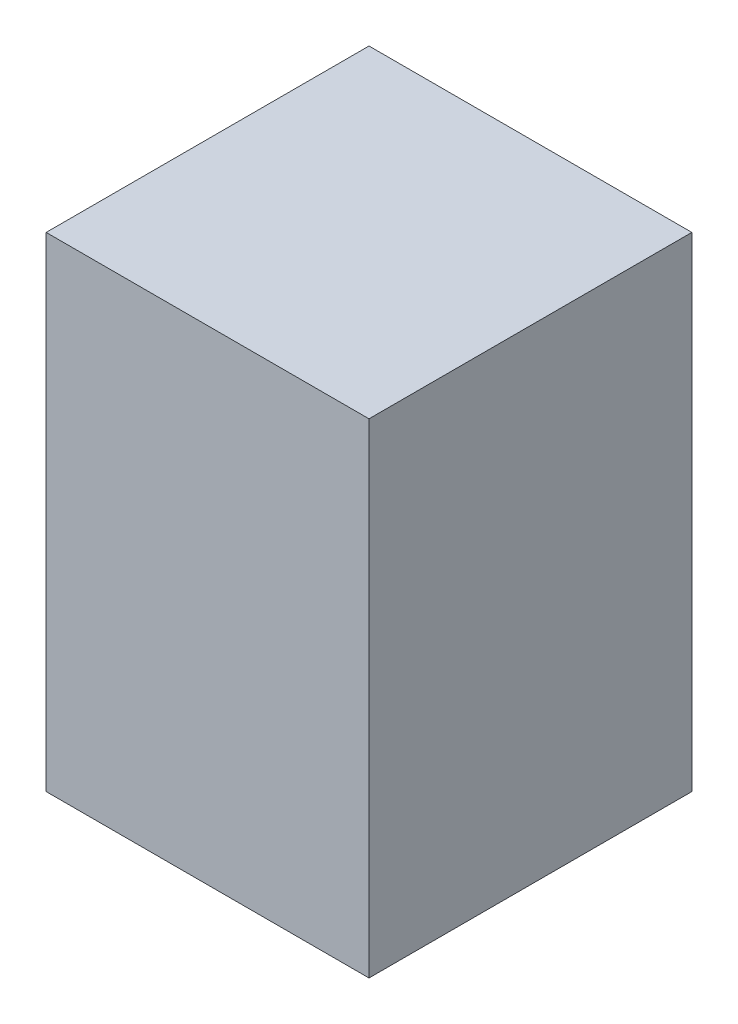
ISO-10303-21;
HEADER;
FILE_DESCRIPTION(('STEP AP214'),'2;1');
FILE_NAME('part.step','',(''),(''),'','','');
FILE_SCHEMA(('AUTOMOTIVE_DESIGN { 1 0 10303 214 1 1 1 1 }'));
ENDSEC;
DATA;
#1=APPLICATION_CONTEXT('core data for automotive mechanical design processes');
#2=APPLICATION_PROTOCOL_DEFINITION('international standard','automotive_design',2000,#1);
#3=PRODUCT_CONTEXT('',#1,'mechanical');
#4=PRODUCT('Part','Part','',(#3));
#5=PRODUCT_RELATED_PRODUCT_CATEGORY('part','',(#4));
#6=PRODUCT_DEFINITION_FORMATION('','',#4);
#7=PRODUCT_DEFINITION_CONTEXT('part definition',#1,'design');
#8=PRODUCT_DEFINITION('design','',#6,#7);
#9=PRODUCT_DEFINITION_SHAPE('','',#8);
#10=(LENGTH_UNIT() NAMED_UNIT(*) SI_UNIT(.MILLI.,.METRE.));
#11=(NAMED_UNIT(*) PLANE_ANGLE_UNIT() SI_UNIT($,.RADIAN.));
#12=(NAMED_UNIT(*) SI_UNIT($,.STERADIAN.) SOLID_ANGLE_UNIT());
#13=UNCERTAINTY_MEASURE_WITH_UNIT(LENGTH_MEASURE(1.E-05),#10,'distance_accuracy_value','');
#14=(GEOMETRIC_REPRESENTATION_CONTEXT(3) GLOBAL_UNCERTAINTY_ASSIGNED_CONTEXT((#13)) GLOBAL_UNIT_ASSIGNED_CONTEXT((#10,
#11,#12)) REPRESENTATION_CONTEXT('',''));
#15=CARTESIAN_POINT('',(0.,0.,0.));
#16=DIRECTION('',(0.,0.,1.));
#17=DIRECTION('',(1.,0.,0.));
#18=AXIS2_PLACEMENT_3D('',#15,#16,#17);
#19=CARTESIAN_POINT('',(76.2,228.6,76.2));
#20=DIRECTION('',(-1.,0.,0.));
#21=DIRECTION('',(0.,0.,1.));
#22=AXIS2_PLACEMENT_3D('',#19,#20,#21);
#23=PLANE('',#22);
#24=DIRECTION('',(0.,0.,-1.));
#25=VECTOR('',#24,1.);
#26=CARTESIAN_POINT('',(76.2,0.,76.2));
#27=LINE('',#26,#25);
#28=CARTESIAN_POINT('',(76.2,0.,76.2));
#29=VERTEX_POINT('',#28);
#30=CARTESIAN_POINT('',(76.2,0.,-76.2));
#31=VERTEX_POINT('',#30);
#32=EDGE_CURVE('E96',#29,#31,#27,.T.);
#33=ORIENTED_EDGE('',*,*,#32,.T.);
#34=DIRECTION('',(0.,-1.,0.));
#35=VECTOR('',#34,1.);
#36=CARTESIAN_POINT('',(76.2,228.6,-76.2));
#37=LINE('',#36,#35);
#38=CARTESIAN_POINT('',(76.2,228.6,-76.2));
#39=VERTEX_POINT('',#38);
#40=EDGE_CURVE('E11',#39,#31,#37,.T.);
#41=ORIENTED_EDGE('',*,*,#40,.F.);
#42=DIRECTION('',(0.,0.,-1.));
#43=VECTOR('',#42,1.);
#44=CARTESIAN_POINT('',(76.2,228.6,76.2));
#45=LINE('',#44,#43);
#46=CARTESIAN_POINT('',(76.2,228.6,76.2));
#47=VERTEX_POINT('',#46);
#48=EDGE_CURVE('E84',#47,#39,#45,.T.);
#49=ORIENTED_EDGE('',*,*,#48,.F.);
#50=DIRECTION('',(0.,-1.,0.));
#51=VECTOR('',#50,1.);
#52=CARTESIAN_POINT('',(76.2,228.6,76.2));
#53=LINE('',#52,#51);
#54=EDGE_CURVE('E92',#47,#29,#53,.T.);
#55=ORIENTED_EDGE('',*,*,#54,.T.);
#56=EDGE_LOOP('',(#33,#41,#49,#55));
#57=FACE_BOUND('',#56,.T.);
#58=ADVANCED_FACE('F33',(#57),#23,.F.);
#59=CARTESIAN_POINT('',(-76.2,228.6,-76.2));
#60=DIRECTION('',(0.,0.,1.));
#61=DIRECTION('',(1.,0.,0.));
#62=AXIS2_PLACEMENT_3D('',#59,#60,#61);
#63=PLANE('',#62);
#64=DIRECTION('',(-1.,0.,0.));
#65=VECTOR('',#64,1.);
#66=CARTESIAN_POINT('',(-76.2,0.,-76.2));
#67=LINE('',#66,#65);
#68=CARTESIAN_POINT('',(-76.2,0.,-76.2));
#69=VERTEX_POINT('',#68);
#70=EDGE_CURVE('E88',#31,#69,#67,.T.);
#71=ORIENTED_EDGE('',*,*,#70,.T.);
#72=DIRECTION('',(0.,-1.,0.));
#73=VECTOR('',#72,1.);
#74=CARTESIAN_POINT('',(-76.2,228.6,-76.2));
#75=LINE('',#74,#73);
#76=CARTESIAN_POINT('',(-76.2,228.6,-76.2));
#77=VERTEX_POINT('',#76);
#78=EDGE_CURVE('E41',#77,#69,#75,.T.);
#79=ORIENTED_EDGE('',*,*,#78,.F.);
#80=DIRECTION('',(-1.,0.,0.));
#81=VECTOR('',#80,1.);
#82=CARTESIAN_POINT('',(-76.2,228.6,-76.2));
#83=LINE('',#82,#81);
#84=EDGE_CURVE('E79',#39,#77,#83,.T.);
#85=ORIENTED_EDGE('',*,*,#84,.F.);
#86=ORIENTED_EDGE('',*,*,#40,.T.);
#87=EDGE_LOOP('',(#71,#79,#85,#86));
#88=FACE_BOUND('',#87,.T.);
#89=ADVANCED_FACE('F87',(#88),#63,.F.);
#90=CARTESIAN_POINT('',(-76.2,228.6,76.2));
#91=DIRECTION('',(1.,0.,0.));
#92=DIRECTION('',(0.,0.,-1.));
#93=AXIS2_PLACEMENT_3D('',#90,#91,#92);
#94=PLANE('',#93);
#95=DIRECTION('',(0.,0.,1.));
#96=VECTOR('',#95,1.);
#97=CARTESIAN_POINT('',(-76.2,0.,76.2));
#98=LINE('',#97,#96);
#99=CARTESIAN_POINT('',(-76.2,0.,76.2));
#100=VERTEX_POINT('',#99);
#101=EDGE_CURVE('E66',#69,#100,#98,.T.);
#102=ORIENTED_EDGE('',*,*,#101,.T.);
#103=DIRECTION('',(0.,-1.,0.));
#104=VECTOR('',#103,1.);
#105=CARTESIAN_POINT('',(-76.2,228.6,76.2));
#106=LINE('',#105,#104);
#107=CARTESIAN_POINT('',(-76.2,228.6,76.2));
#108=VERTEX_POINT('',#107);
#109=EDGE_CURVE('E89',#108,#100,#106,.T.);
#110=ORIENTED_EDGE('',*,*,#109,.F.);
#111=DIRECTION('',(0.,0.,1.));
#112=VECTOR('',#111,1.);
#113=CARTESIAN_POINT('',(-76.2,228.6,76.2));
#114=LINE('',#113,#112);
#115=EDGE_CURVE('E82',#77,#108,#114,.T.);
#116=ORIENTED_EDGE('',*,*,#115,.F.);
#117=ORIENTED_EDGE('',*,*,#78,.T.);
#118=EDGE_LOOP('',(#102,#110,#116,#117));
#119=FACE_BOUND('',#118,.T.);
#120=ADVANCED_FACE('F90',(#119),#94,.F.);
#121=CARTESIAN_POINT('',(-76.2,228.6,76.2));
#122=DIRECTION('',(0.,0.,-1.));
#123=DIRECTION('',(-1.,0.,0.));
#124=AXIS2_PLACEMENT_3D('',#121,#122,#123);
#125=PLANE('',#124);
#126=DIRECTION('',(1.,0.,0.));
#127=VECTOR('',#126,1.);
#128=CARTESIAN_POINT('',(-76.2,0.,76.2));
#129=LINE('',#128,#127);
#130=EDGE_CURVE('E72',#100,#29,#129,.T.);
#131=ORIENTED_EDGE('',*,*,#130,.T.);
#132=ORIENTED_EDGE('',*,*,#54,.F.);
#133=DIRECTION('',(1.,0.,0.));
#134=VECTOR('',#133,1.);
#135=CARTESIAN_POINT('',(-76.2,228.6,76.2));
#136=LINE('',#135,#134);
#137=EDGE_CURVE('E49',#108,#47,#136,.T.);
#138=ORIENTED_EDGE('',*,*,#137,.F.);
#139=ORIENTED_EDGE('',*,*,#109,.T.);
#140=EDGE_LOOP('',(#131,#132,#138,#139));
#141=FACE_BOUND('',#140,.T.);
#142=ADVANCED_FACE('F103',(#141),#125,.F.);
#143=CARTESIAN_POINT('',(0.,228.6,0.));
#144=DIRECTION('',(0.,-1.,0.));
#145=DIRECTION('',(0.,0.,-1.));
#146=AXIS2_PLACEMENT_3D('',#143,#144,#145);
#147=PLANE('',#146);
#148=ORIENTED_EDGE('',*,*,#48,.T.);
#149=ORIENTED_EDGE('',*,*,#84,.T.);
#150=ORIENTED_EDGE('',*,*,#115,.T.);
#151=ORIENTED_EDGE('',*,*,#137,.T.);
#152=EDGE_LOOP('',(#148,#149,#150,#151));
#153=FACE_BOUND('',#152,.T.);
#154=ADVANCED_FACE('F80',(#153),#147,.F.);
#155=CARTESIAN_POINT('',(0.,0.,0.));
#156=DIRECTION('',(0.,-1.,0.));
#157=DIRECTION('',(0.,0.,-1.));
#158=AXIS2_PLACEMENT_3D('',#155,#156,#157);
#159=PLANE('',#158);
#160=ORIENTED_EDGE('',*,*,#32,.F.);
#161=ORIENTED_EDGE('',*,*,#130,.F.);
#162=ORIENTED_EDGE('',*,*,#101,.F.);
#163=ORIENTED_EDGE('',*,*,#70,.F.);
#164=EDGE_LOOP('',(#160,#161,#162,#163));
#165=FACE_BOUND('',#164,.T.);
#166=ADVANCED_FACE('F106',(#165),#159,.T.);
#167=CLOSED_SHELL('',(#58,#89,#120,#142,#154,#166));
#168=MANIFOLD_SOLID_BREP('B2',#167);
#169=ADVANCED_BREP_SHAPE_REPRESENTATION('',(#18,#168),#14);
#170=SHAPE_DEFINITION_REPRESENTATION(#9,#169);
ENDSEC;
END-ISO-10303-21;
